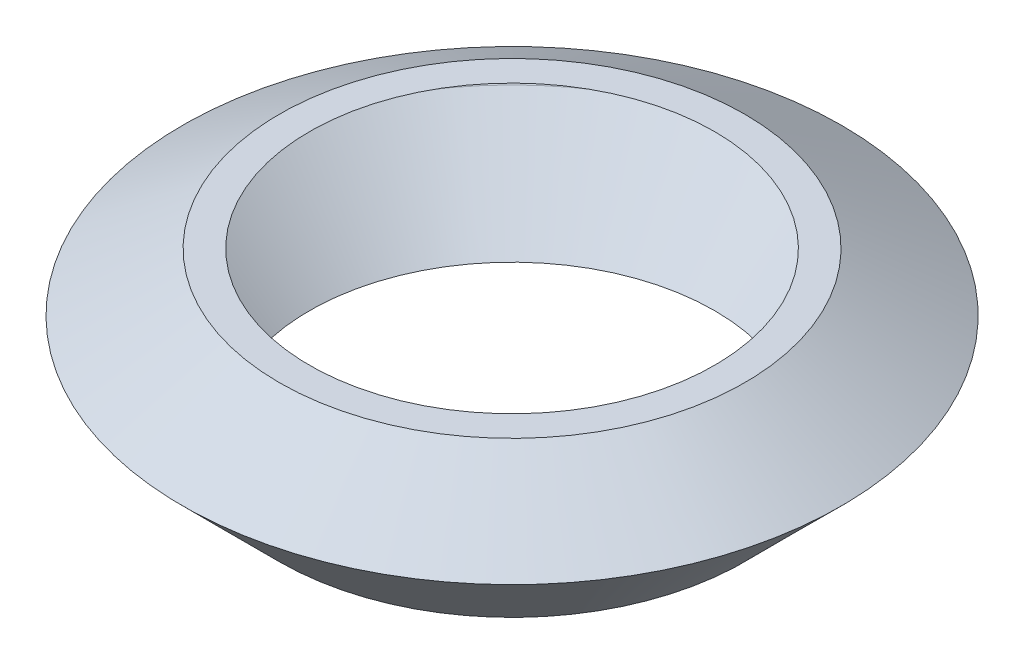
ISO-10303-21;
HEADER;
FILE_DESCRIPTION(('STEP AP214'),'2;1');
FILE_NAME('part.step','',(''),(''),'','','');
FILE_SCHEMA(('AUTOMOTIVE_DESIGN { 1 0 10303 214 1 1 1 1 }'));
ENDSEC;
DATA;
#1=APPLICATION_CONTEXT('core data for automotive mechanical design processes');
#2=APPLICATION_PROTOCOL_DEFINITION('international standard','automotive_design',2000,#1);
#3=PRODUCT_CONTEXT('',#1,'mechanical');
#4=PRODUCT('Part','Part','',(#3));
#5=PRODUCT_RELATED_PRODUCT_CATEGORY('part','',(#4));
#6=PRODUCT_DEFINITION_FORMATION('','',#4);
#7=PRODUCT_DEFINITION_CONTEXT('part definition',#1,'design');
#8=PRODUCT_DEFINITION('design','',#6,#7);
#9=PRODUCT_DEFINITION_SHAPE('','',#8);
#10=(LENGTH_UNIT() NAMED_UNIT(*) SI_UNIT(.MILLI.,.METRE.));
#11=(NAMED_UNIT(*) PLANE_ANGLE_UNIT() SI_UNIT($,.RADIAN.));
#12=(NAMED_UNIT(*) SI_UNIT($,.STERADIAN.) SOLID_ANGLE_UNIT());
#13=UNCERTAINTY_MEASURE_WITH_UNIT(LENGTH_MEASURE(1.E-05),#10,'distance_accuracy_value','');
#14=(GEOMETRIC_REPRESENTATION_CONTEXT(3) GLOBAL_UNCERTAINTY_ASSIGNED_CONTEXT((#13)) GLOBAL_UNIT_ASSIGNED_CONTEXT((#10,
#11,#12)) REPRESENTATION_CONTEXT('',''));
#15=CARTESIAN_POINT('',(0.,0.,0.));
#16=DIRECTION('',(0.,0.,1.));
#17=DIRECTION('',(1.,0.,0.));
#18=AXIS2_PLACEMENT_3D('',#15,#16,#17);
#19=CARTESIAN_POINT('',(-12.,0.,0.));
#20=DIRECTION('',(0.,1.,0.));
#21=DIRECTION('',(0.,0.,1.));
#22=AXIS2_PLACEMENT_3D('',#19,#20,#21);
#23=PLANE('',#22);
#24=CARTESIAN_POINT('',(0.,0.,0.));
#25=DIRECTION('',(0.,-1.,0.));
#26=DIRECTION('',(0.,0.,-1.));
#27=AXIS2_PLACEMENT_3D('',#24,#25,#26);
#28=CIRCLE('',#27,10.4450794947079);
#29=CARTESIAN_POINT('',(0.,0.,-10.4450794947079));
#30=VERTEX_POINT('',#29);
#31=EDGE_CURVE('E81',#30,#30,#28,.T.);
#32=ORIENTED_EDGE('',*,*,#31,.F.);
#33=EDGE_LOOP('',(#32));
#34=FACE_BOUND('',#33,.T.);
#35=CARTESIAN_POINT('',(0.,0.,0.));
#36=DIRECTION('',(0.,-1.,0.));
#37=DIRECTION('',(0.,0.,-1.));
#38=AXIS2_PLACEMENT_3D('',#35,#36,#37);
#39=CIRCLE('',#38,12.);
#40=CARTESIAN_POINT('',(0.,0.,-12.));
#41=VERTEX_POINT('',#40);
#42=EDGE_CURVE('E62',#41,#41,#39,.T.);
#43=ORIENTED_EDGE('',*,*,#42,.T.);
#44=EDGE_LOOP('',(#43));
#45=FACE_BOUND('',#44,.T.);
#46=ADVANCED_FACE('F49',(#34,#45),#23,.F.);
#47=CARTESIAN_POINT('',(0.,5.,0.));
#48=DIRECTION('',(0.,1.,0.));
#49=DIRECTION('',(0.,0.,1.));
#50=AXIS2_PLACEMENT_3D('',#47,#48,#49);
#51=CONICAL_SURFACE('',#50,17.,0.785398163397449);
#52=ORIENTED_EDGE('',*,*,#42,.F.);
#53=EDGE_LOOP('',(#52));
#54=FACE_BOUND('',#53,.T.);
#55=CARTESIAN_POINT('',(0.,5.,0.));
#56=DIRECTION('',(0.,-1.,0.));
#57=DIRECTION('',(0.,0.,-1.));
#58=AXIS2_PLACEMENT_3D('',#55,#56,#57);
#59=CIRCLE('',#58,17.);
#60=CARTESIAN_POINT('',(0.,5.,-17.));
#61=VERTEX_POINT('',#60);
#62=EDGE_CURVE('E67',#61,#61,#59,.T.);
#63=ORIENTED_EDGE('',*,*,#62,.T.);
#64=EDGE_LOOP('',(#63));
#65=FACE_BOUND('',#64,.T.);
#66=ADVANCED_FACE('F90',(#54,#65),#51,.T.);
#67=CARTESIAN_POINT('',(0.,8.,0.));
#68=DIRECTION('',(0.,-1.,0.));
#69=DIRECTION('',(0.,0.,-1.));
#70=AXIS2_PLACEMENT_3D('',#67,#68,#69);
#71=CONICAL_SURFACE('',#70,12.,1.03037682652431);
#72=ORIENTED_EDGE('',*,*,#62,.F.);
#73=EDGE_LOOP('',(#72));
#74=FACE_BOUND('',#73,.T.);
#75=CARTESIAN_POINT('',(0.,8.,0.));
#76=DIRECTION('',(0.,-1.,0.));
#77=DIRECTION('',(0.,0.,-1.));
#78=AXIS2_PLACEMENT_3D('',#75,#76,#77);
#79=CIRCLE('',#78,12.);
#80=CARTESIAN_POINT('',(0.,8.,-12.));
#81=VERTEX_POINT('',#80);
#82=EDGE_CURVE('E73',#81,#81,#79,.T.);
#83=ORIENTED_EDGE('',*,*,#82,.T.);
#84=EDGE_LOOP('',(#83));
#85=FACE_BOUND('',#84,.T.);
#86=ADVANCED_FACE('F95',(#74,#85),#71,.T.);
#87=CARTESIAN_POINT('',(-12.,8.,0.));
#88=DIRECTION('',(0.,-1.,0.));
#89=DIRECTION('',(0.,0.,-1.));
#90=AXIS2_PLACEMENT_3D('',#87,#88,#89);
#91=PLANE('',#90);
#92=ORIENTED_EDGE('',*,*,#82,.F.);
#93=EDGE_LOOP('',(#92));
#94=FACE_BOUND('',#93,.T.);
#95=CARTESIAN_POINT('',(0.,8.,0.));
#96=DIRECTION('',(0.,-1.,0.));
#97=DIRECTION('',(0.,0.,-1.));
#98=AXIS2_PLACEMENT_3D('',#95,#96,#97);
#99=CIRCLE('',#98,10.4450794947079);
#100=CARTESIAN_POINT('',(0.,8.,-10.4450794947079));
#101=VERTEX_POINT('',#100);
#102=EDGE_CURVE('E77',#101,#101,#99,.T.);
#103=ORIENTED_EDGE('',*,*,#102,.T.);
#104=EDGE_LOOP('',(#103));
#105=FACE_BOUND('',#104,.T.);
#106=ADVANCED_FACE('F101',(#94,#105),#91,.F.);
#107=CARTESIAN_POINT('',(0.,5.,0.));
#108=DIRECTION('',(0.,-1.,0.));
#109=DIRECTION('',(0.,0.,-1.));
#110=AXIS2_PLACEMENT_3D('',#107,#108,#109);
#111=CONICAL_SURFACE('',#110,15.4450794947079,1.03037682652431);
#112=CARTESIAN_POINT('',(0.,5.26358160989872,0.));
#113=DIRECTION('',(0.,-1.,0.));
#114=DIRECTION('',(0.,0.,-1.));
#115=AXIS2_PLACEMENT_3D('',#112,#113,#114);
#116=CIRCLE('',#115,15.0057768115434);
#117=CARTESIAN_POINT('',(0.,5.26358160989872,-15.0057768115434));
#118=VERTEX_POINT('',#117);
#119=EDGE_CURVE('E57',#118,#118,#116,.T.);
#120=ORIENTED_EDGE('',*,*,#119,.T.);
#121=EDGE_LOOP('',(#120));
#122=FACE_BOUND('',#121,.T.);
#123=ORIENTED_EDGE('',*,*,#102,.F.);
#124=EDGE_LOOP('',(#123));
#125=FACE_BOUND('',#124,.T.);
#126=ADVANCED_FACE('F107',(#122,#125),#111,.F.);
#127=CARTESIAN_POINT('',(0.,0.,0.));
#128=DIRECTION('',(0.,1.,0.));
#129=DIRECTION('',(0.,0.,1.));
#130=AXIS2_PLACEMENT_3D('',#127,#128,#129);
#131=CONICAL_SURFACE('',#130,10.4450794947079,0.785398163397448);
#132=CARTESIAN_POINT('',(0.,4.63774172713908,0.));
#133=DIRECTION('',(0.,1.,0.));
#134=DIRECTION('',(0.,0.,1.));
#135=AXIS2_PLACEMENT_3D('',#132,#133,#134);
#136=CIRCLE('',#135,15.082821221847);
#137=CARTESIAN_POINT('',(0.,4.63774172713908,15.082821221847));
#138=VERTEX_POINT('',#137);
#139=EDGE_CURVE('E10',#138,#138,#136,.T.);
#140=ORIENTED_EDGE('',*,*,#139,.T.);
#141=EDGE_LOOP('',(#140));
#142=FACE_BOUND('',#141,.T.);
#143=ORIENTED_EDGE('',*,*,#31,.T.);
#144=EDGE_LOOP('',(#143));
#145=FACE_BOUND('',#144,.T.);
#146=ADVANCED_FACE('F86',(#142,#145),#131,.F.);
#147=CARTESIAN_POINT('',(0.,4.9205844396137,0.));
#148=DIRECTION('',(0.,-1.,0.));
#149=DIRECTION('',(0.,0.,-1.));
#150=AXIS2_PLACEMENT_3D('',#147,#148,#149);
#151=TOROIDAL_SURFACE('',#150,14.7999785093724,0.4);
#152=ORIENTED_EDGE('',*,*,#139,.F.);
#153=EDGE_LOOP('',(#152));
#154=FACE_BOUND('',#153,.T.);
#155=ORIENTED_EDGE('',*,*,#119,.F.);
#156=EDGE_LOOP('',(#155));
#157=FACE_BOUND('',#156,.T.);
#158=ADVANCED_FACE('F51',(#154,#157),#151,.F.);
#159=CLOSED_SHELL('',(#46,#66,#86,#106,#126,#146,#158));
#160=MANIFOLD_SOLID_BREP('B2',#159);
#161=ADVANCED_BREP_SHAPE_REPRESENTATION('',(#18,#160),#14);
#162=SHAPE_DEFINITION_REPRESENTATION(#9,#161);
ENDSEC;
END-ISO-10303-21;
